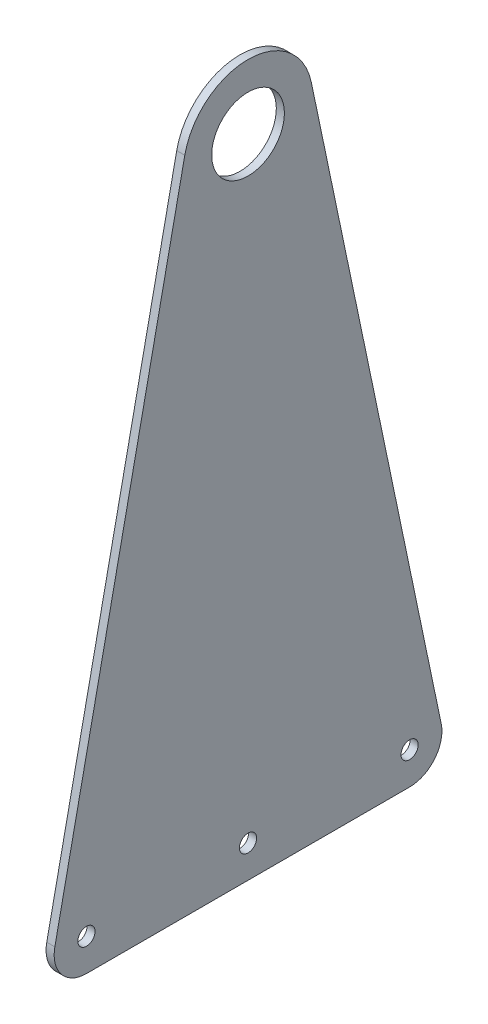
ISO-10303-21;
HEADER;
FILE_DESCRIPTION(('STEP AP214'),'2;1');
FILE_NAME('part.step','',(''),(''),'','','');
FILE_SCHEMA(('AUTOMOTIVE_DESIGN { 1 0 10303 214 1 1 1 1 }'));
ENDSEC;
DATA;
#1=APPLICATION_CONTEXT('core data for automotive mechanical design processes');
#2=APPLICATION_PROTOCOL_DEFINITION('international standard','automotive_design',2000,#1);
#3=PRODUCT_CONTEXT('',#1,'mechanical');
#4=PRODUCT('Part','Part','',(#3));
#5=PRODUCT_RELATED_PRODUCT_CATEGORY('part','',(#4));
#6=PRODUCT_DEFINITION_FORMATION('','',#4);
#7=PRODUCT_DEFINITION_CONTEXT('part definition',#1,'design');
#8=PRODUCT_DEFINITION('design','',#6,#7);
#9=PRODUCT_DEFINITION_SHAPE('','',#8);
#10=(LENGTH_UNIT() NAMED_UNIT(*) SI_UNIT(.MILLI.,.METRE.));
#11=(NAMED_UNIT(*) PLANE_ANGLE_UNIT() SI_UNIT($,.RADIAN.));
#12=(NAMED_UNIT(*) SI_UNIT($,.STERADIAN.) SOLID_ANGLE_UNIT());
#13=UNCERTAINTY_MEASURE_WITH_UNIT(LENGTH_MEASURE(1.E-05),#10,'distance_accuracy_value','');
#14=(GEOMETRIC_REPRESENTATION_CONTEXT(3) GLOBAL_UNCERTAINTY_ASSIGNED_CONTEXT((#13)) GLOBAL_UNIT_ASSIGNED_CONTEXT((#10,
#11,#12)) REPRESENTATION_CONTEXT('',''));
#15=CARTESIAN_POINT('',(0.,0.,0.));
#16=DIRECTION('',(0.,0.,1.));
#17=DIRECTION('',(1.,0.,0.));
#18=AXIS2_PLACEMENT_3D('',#15,#16,#17);
#19=CARTESIAN_POINT('',(3.175,-241.3,63.5));
#20=DIRECTION('',(1.,0.,0.));
#21=DIRECTION('',(0.,0.,-1.));
#22=AXIS2_PLACEMENT_3D('',#19,#20,#21);
#23=PLANE('',#22);
#24=CARTESIAN_POINT('',(3.175,-241.3,0.));
#25=DIRECTION('',(1.,0.,0.));
#26=DIRECTION('',(0.,0.,-1.));
#27=AXIS2_PLACEMENT_3D('',#24,#25,#26);
#28=CIRCLE('',#27,3.3782);
#29=CARTESIAN_POINT('',(3.175,-241.3,-3.3782));
#30=VERTEX_POINT('',#29);
#31=EDGE_CURVE('E216',#30,#30,#28,.T.);
#32=ORIENTED_EDGE('',*,*,#31,.F.);
#33=EDGE_LOOP('',(#32));
#34=FACE_BOUND('',#33,.T.);
#35=CARTESIAN_POINT('',(3.175,0.,0.));
#36=DIRECTION('',(1.,0.,0.));
#37=DIRECTION('',(0.,0.,-1.));
#38=AXIS2_PLACEMENT_3D('',#35,#36,#37);
#39=CIRCLE('',#38,14.2875);
#40=CARTESIAN_POINT('',(3.175,0.,-14.2875));
#41=VERTEX_POINT('',#40);
#42=EDGE_CURVE('E138',#41,#41,#39,.T.);
#43=ORIENTED_EDGE('',*,*,#42,.F.);
#44=EDGE_LOOP('',(#43));
#45=FACE_BOUND('',#44,.T.);
#46=CARTESIAN_POINT('',(3.175,-241.3,63.5));
#47=DIRECTION('',(1.,0.,0.));
#48=DIRECTION('',(0.,0.,-1.));
#49=AXIS2_PLACEMENT_3D('',#46,#47,#48);
#50=CIRCLE('',#49,12.7);
#51=CARTESIAN_POINT('',(3.175,-238.697253960448,75.9304349502982));
#52=VERTEX_POINT('',#51);
#53=CARTESIAN_POINT('',(3.175,-254.,63.5));
#54=VERTEX_POINT('',#53);
#55=EDGE_CURVE('E150',#52,#54,#50,.T.);
#56=ORIENTED_EDGE('',*,*,#55,.T.);
#57=DIRECTION('',(0.,0.,-1.));
#58=VECTOR('',#57,1.);
#59=CARTESIAN_POINT('',(3.175,-254.,-63.5));
#60=LINE('',#59,#58);
#61=CARTESIAN_POINT('',(3.175,-254.,-63.5));
#62=VERTEX_POINT('',#61);
#63=EDGE_CURVE('E98',#54,#62,#60,.T.);
#64=ORIENTED_EDGE('',*,*,#63,.T.);
#65=CARTESIAN_POINT('',(3.175,-241.3,-63.5));
#66=DIRECTION('',(1.,0.,0.));
#67=DIRECTION('',(0.,0.,-1.));
#68=AXIS2_PLACEMENT_3D('',#65,#66,#67);
#69=CIRCLE('',#68,12.7);
#70=CARTESIAN_POINT('',(3.175,-238.697253960448,-75.9304349502982));
#71=VERTEX_POINT('',#70);
#72=EDGE_CURVE('E111',#62,#71,#69,.T.);
#73=ORIENTED_EDGE('',*,*,#72,.T.);
#74=DIRECTION('',(0.,0.978774405535293,0.204940633035603));
#75=VECTOR('',#74,1.);
#76=CARTESIAN_POINT('',(3.175,5.20549207910432,-24.8608699005964));
#77=LINE('',#76,#75);
#78=CARTESIAN_POINT('',(3.175,5.20549207910432,-24.8608699005964));
#79=VERTEX_POINT('',#78);
#80=EDGE_CURVE('E105',#71,#79,#77,.T.);
#81=ORIENTED_EDGE('',*,*,#80,.T.);
#82=CARTESIAN_POINT('',(3.175,0.,0.));
#83=DIRECTION('',(1.,0.,0.));
#84=DIRECTION('',(0.,0.,-1.));
#85=AXIS2_PLACEMENT_3D('',#82,#83,#84);
#86=CIRCLE('',#85,25.4);
#87=CARTESIAN_POINT('',(3.175,5.20549207910433,24.8608699005964));
#88=VERTEX_POINT('',#87);
#89=EDGE_CURVE('E109',#79,#88,#86,.T.);
#90=ORIENTED_EDGE('',*,*,#89,.T.);
#91=DIRECTION('',(0.,-0.978774405535293,0.204940633035603));
#92=VECTOR('',#91,1.);
#93=CARTESIAN_POINT('',(3.175,-238.697253960448,75.9304349502982));
#94=LINE('',#93,#92);
#95=EDGE_CURVE('E61',#88,#52,#94,.T.);
#96=ORIENTED_EDGE('',*,*,#95,.T.);
#97=EDGE_LOOP('',(#56,#64,#73,#81,#90,#96));
#98=FACE_BOUND('',#97,.T.);
#99=CARTESIAN_POINT('',(3.175,-241.3,63.5));
#100=DIRECTION('',(1.,0.,0.));
#101=DIRECTION('',(0.,0.,-1.));
#102=AXIS2_PLACEMENT_3D('',#99,#100,#101);
#103=CIRCLE('',#102,3.3782);
#104=CARTESIAN_POINT('',(3.175,-241.3,60.1218));
#105=VERTEX_POINT('',#104);
#106=EDGE_CURVE('E224',#105,#105,#103,.T.);
#107=ORIENTED_EDGE('',*,*,#106,.F.);
#108=EDGE_LOOP('',(#107));
#109=FACE_BOUND('',#108,.T.);
#110=CARTESIAN_POINT('',(3.175,-241.3,-63.5));
#111=DIRECTION('',(1.,0.,0.));
#112=DIRECTION('',(0.,0.,-1.));
#113=AXIS2_PLACEMENT_3D('',#110,#111,#112);
#114=CIRCLE('',#113,3.37819999999999);
#115=CARTESIAN_POINT('',(3.175,-241.3,-66.8782));
#116=VERTEX_POINT('',#115);
#117=EDGE_CURVE('E205',#116,#116,#114,.T.);
#118=ORIENTED_EDGE('',*,*,#117,.F.);
#119=EDGE_LOOP('',(#118));
#120=FACE_BOUND('',#119,.T.);
#121=ADVANCED_FACE('F43',(#34,#45,#98,#109,#120),#23,.T.);
#122=CARTESIAN_POINT('',(0.,-241.3,63.5));
#123=DIRECTION('',(1.,0.,0.));
#124=DIRECTION('',(0.,0.,-1.));
#125=AXIS2_PLACEMENT_3D('',#122,#123,#124);
#126=PLANE('',#125);
#127=CARTESIAN_POINT('',(0.,-241.3,63.5));
#128=DIRECTION('',(1.,0.,0.));
#129=DIRECTION('',(0.,0.,-1.));
#130=AXIS2_PLACEMENT_3D('',#127,#128,#129);
#131=CIRCLE('',#130,12.7);
#132=CARTESIAN_POINT('',(0.,-238.697253960448,75.9304349502982));
#133=VERTEX_POINT('',#132);
#134=CARTESIAN_POINT('',(0.,-254.,63.5));
#135=VERTEX_POINT('',#134);
#136=EDGE_CURVE('E133',#133,#135,#131,.T.);
#137=ORIENTED_EDGE('',*,*,#136,.F.);
#138=DIRECTION('',(0.,-0.978774405535293,0.204940633035603));
#139=VECTOR('',#138,1.);
#140=CARTESIAN_POINT('',(0.,-238.697253960448,75.9304349502982));
#141=LINE('',#140,#139);
#142=CARTESIAN_POINT('',(0.,5.20549207910433,24.8608699005964));
#143=VERTEX_POINT('',#142);
#144=EDGE_CURVE('E90',#143,#133,#141,.T.);
#145=ORIENTED_EDGE('',*,*,#144,.F.);
#146=CARTESIAN_POINT('',(0.,0.,0.));
#147=DIRECTION('',(1.,0.,0.));
#148=DIRECTION('',(0.,0.,-1.));
#149=AXIS2_PLACEMENT_3D('',#146,#147,#148);
#150=CIRCLE('',#149,25.4);
#151=CARTESIAN_POINT('',(0.,5.20549207910432,-24.8608699005964));
#152=VERTEX_POINT('',#151);
#153=EDGE_CURVE('E84',#152,#143,#150,.T.);
#154=ORIENTED_EDGE('',*,*,#153,.F.);
#155=DIRECTION('',(0.,0.978774405535293,0.204940633035603));
#156=VECTOR('',#155,1.);
#157=CARTESIAN_POINT('',(0.,5.20549207910432,-24.8608699005964));
#158=LINE('',#157,#156);
#159=CARTESIAN_POINT('',(0.,-238.697253960448,-75.9304349502982));
#160=VERTEX_POINT('',#159);
#161=EDGE_CURVE('E120',#160,#152,#158,.T.);
#162=ORIENTED_EDGE('',*,*,#161,.F.);
#163=CARTESIAN_POINT('',(0.,-241.3,-63.5));
#164=DIRECTION('',(1.,0.,0.));
#165=DIRECTION('',(0.,0.,-1.));
#166=AXIS2_PLACEMENT_3D('',#163,#164,#165);
#167=CIRCLE('',#166,12.7);
#168=CARTESIAN_POINT('',(0.,-254.,-63.5));
#169=VERTEX_POINT('',#168);
#170=EDGE_CURVE('E141',#169,#160,#167,.T.);
#171=ORIENTED_EDGE('',*,*,#170,.F.);
#172=DIRECTION('',(0.,0.,-1.));
#173=VECTOR('',#172,1.);
#174=CARTESIAN_POINT('',(0.,-254.,-63.5));
#175=LINE('',#174,#173);
#176=EDGE_CURVE('E137',#135,#169,#175,.T.);
#177=ORIENTED_EDGE('',*,*,#176,.F.);
#178=EDGE_LOOP('',(#137,#145,#154,#162,#171,#177));
#179=FACE_BOUND('',#178,.T.);
#180=CARTESIAN_POINT('',(0.,0.,0.));
#181=DIRECTION('',(1.,0.,0.));
#182=DIRECTION('',(0.,0.,-1.));
#183=AXIS2_PLACEMENT_3D('',#180,#181,#182);
#184=CIRCLE('',#183,14.2875);
#185=CARTESIAN_POINT('',(0.,0.,-14.2875));
#186=VERTEX_POINT('',#185);
#187=EDGE_CURVE('E228',#186,#186,#184,.T.);
#188=ORIENTED_EDGE('',*,*,#187,.T.);
#189=EDGE_LOOP('',(#188));
#190=FACE_BOUND('',#189,.T.);
#191=CARTESIAN_POINT('',(0.,-241.3,63.5));
#192=DIRECTION('',(1.,0.,0.));
#193=DIRECTION('',(0.,0.,-1.));
#194=AXIS2_PLACEMENT_3D('',#191,#192,#193);
#195=CIRCLE('',#194,3.3782);
#196=CARTESIAN_POINT('',(0.,-241.3,60.1218));
#197=VERTEX_POINT('',#196);
#198=EDGE_CURVE('E220',#197,#197,#195,.T.);
#199=ORIENTED_EDGE('',*,*,#198,.T.);
#200=EDGE_LOOP('',(#199));
#201=FACE_BOUND('',#200,.T.);
#202=CARTESIAN_POINT('',(0.,-241.3,0.));
#203=DIRECTION('',(1.,0.,0.));
#204=DIRECTION('',(0.,0.,-1.));
#205=AXIS2_PLACEMENT_3D('',#202,#203,#204);
#206=CIRCLE('',#205,3.3782);
#207=CARTESIAN_POINT('',(0.,-241.3,-3.3782));
#208=VERTEX_POINT('',#207);
#209=EDGE_CURVE('E213',#208,#208,#206,.T.);
#210=ORIENTED_EDGE('',*,*,#209,.T.);
#211=EDGE_LOOP('',(#210));
#212=FACE_BOUND('',#211,.T.);
#213=CARTESIAN_POINT('',(0.,-241.3,-63.5));
#214=DIRECTION('',(1.,0.,0.));
#215=DIRECTION('',(0.,0.,-1.));
#216=AXIS2_PLACEMENT_3D('',#213,#214,#215);
#217=CIRCLE('',#216,3.37819999999999);
#218=CARTESIAN_POINT('',(0.,-241.3,-66.8782));
#219=VERTEX_POINT('',#218);
#220=EDGE_CURVE('E208',#219,#219,#217,.T.);
#221=ORIENTED_EDGE('',*,*,#220,.T.);
#222=EDGE_LOOP('',(#221));
#223=FACE_BOUND('',#222,.T.);
#224=ADVANCED_FACE('F163',(#179,#190,#201,#212,#223),#126,.F.);
#225=CARTESIAN_POINT('',(3.175,-241.3,63.5));
#226=DIRECTION('',(-1.,0.,0.));
#227=DIRECTION('',(0.,0.,1.));
#228=AXIS2_PLACEMENT_3D('',#225,#226,#227);
#229=CYLINDRICAL_SURFACE('',#228,12.7);
#230=ORIENTED_EDGE('',*,*,#136,.T.);
#231=DIRECTION('',(-1.,0.,0.));
#232=VECTOR('',#231,1.);
#233=CARTESIAN_POINT('',(3.175,-254.,63.5));
#234=LINE('',#233,#232);
#235=EDGE_CURVE('E11',#54,#135,#234,.T.);
#236=ORIENTED_EDGE('',*,*,#235,.F.);
#237=ORIENTED_EDGE('',*,*,#55,.F.);
#238=DIRECTION('',(-1.,0.,0.));
#239=VECTOR('',#238,1.);
#240=CARTESIAN_POINT('',(3.175,-238.697253960448,75.9304349502982));
#241=LINE('',#240,#239);
#242=EDGE_CURVE('E129',#52,#133,#241,.T.);
#243=ORIENTED_EDGE('',*,*,#242,.T.);
#244=EDGE_LOOP('',(#230,#236,#237,#243));
#245=FACE_BOUND('',#244,.T.);
#246=ADVANCED_FACE('F45',(#245),#229,.T.);
#247=CARTESIAN_POINT('',(3.175,-254.,-63.5));
#248=DIRECTION('',(0.,1.,0.));
#249=DIRECTION('',(0.,0.,1.));
#250=AXIS2_PLACEMENT_3D('',#247,#248,#249);
#251=PLANE('',#250);
#252=ORIENTED_EDGE('',*,*,#176,.T.);
#253=DIRECTION('',(-1.,0.,0.));
#254=VECTOR('',#253,1.);
#255=CARTESIAN_POINT('',(3.175,-254.,-63.5));
#256=LINE('',#255,#254);
#257=EDGE_CURVE('E53',#62,#169,#256,.T.);
#258=ORIENTED_EDGE('',*,*,#257,.F.);
#259=ORIENTED_EDGE('',*,*,#63,.F.);
#260=ORIENTED_EDGE('',*,*,#235,.T.);
#261=EDGE_LOOP('',(#252,#258,#259,#260));
#262=FACE_BOUND('',#261,.T.);
#263=ADVANCED_FACE('F296',(#262),#251,.F.);
#264=CARTESIAN_POINT('',(3.175,-241.3,-63.5));
#265=DIRECTION('',(-1.,0.,0.));
#266=DIRECTION('',(0.,0.,1.));
#267=AXIS2_PLACEMENT_3D('',#264,#265,#266);
#268=CYLINDRICAL_SURFACE('',#267,12.7);
#269=ORIENTED_EDGE('',*,*,#170,.T.);
#270=DIRECTION('',(-1.,0.,0.));
#271=VECTOR('',#270,1.);
#272=CARTESIAN_POINT('',(3.175,-238.697253960448,-75.9304349502982));
#273=LINE('',#272,#271);
#274=EDGE_CURVE('E122',#71,#160,#273,.T.);
#275=ORIENTED_EDGE('',*,*,#274,.F.);
#276=ORIENTED_EDGE('',*,*,#72,.F.);
#277=ORIENTED_EDGE('',*,*,#257,.T.);
#278=EDGE_LOOP('',(#269,#275,#276,#277));
#279=FACE_BOUND('',#278,.T.);
#280=ADVANCED_FACE('F160',(#279),#268,.T.);
#281=CARTESIAN_POINT('',(3.175,5.20549207910432,-24.8608699005964));
#282=DIRECTION('',(0.,-0.204940633035603,0.978774405535293));
#283=DIRECTION('',(0.,-0.978774405535293,-0.204940633035603));
#284=AXIS2_PLACEMENT_3D('',#281,#282,#283);
#285=PLANE('',#284);
#286=ORIENTED_EDGE('',*,*,#161,.T.);
#287=DIRECTION('',(-1.,0.,0.));
#288=VECTOR('',#287,1.);
#289=CARTESIAN_POINT('',(3.175,5.20549207910432,-24.8608699005964));
#290=LINE('',#289,#288);
#291=EDGE_CURVE('E117',#79,#152,#290,.T.);
#292=ORIENTED_EDGE('',*,*,#291,.F.);
#293=ORIENTED_EDGE('',*,*,#80,.F.);
#294=ORIENTED_EDGE('',*,*,#274,.T.);
#295=EDGE_LOOP('',(#286,#292,#293,#294));
#296=FACE_BOUND('',#295,.T.);
#297=ADVANCED_FACE('F118',(#296),#285,.F.);
#298=CARTESIAN_POINT('',(3.175,0.,0.));
#299=DIRECTION('',(-1.,0.,0.));
#300=DIRECTION('',(0.,0.,1.));
#301=AXIS2_PLACEMENT_3D('',#298,#299,#300);
#302=CYLINDRICAL_SURFACE('',#301,25.4);
#303=ORIENTED_EDGE('',*,*,#153,.T.);
#304=DIRECTION('',(-1.,0.,0.));
#305=VECTOR('',#304,1.);
#306=CARTESIAN_POINT('',(3.175,5.20549207910433,24.8608699005964));
#307=LINE('',#306,#305);
#308=EDGE_CURVE('E123',#88,#143,#307,.T.);
#309=ORIENTED_EDGE('',*,*,#308,.F.);
#310=ORIENTED_EDGE('',*,*,#89,.F.);
#311=ORIENTED_EDGE('',*,*,#291,.T.);
#312=EDGE_LOOP('',(#303,#309,#310,#311));
#313=FACE_BOUND('',#312,.T.);
#314=ADVANCED_FACE('F125',(#313),#302,.T.);
#315=CARTESIAN_POINT('',(3.175,-238.697253960448,75.9304349502982));
#316=DIRECTION('',(0.,-0.204940633035603,-0.978774405535293));
#317=DIRECTION('',(0.,0.978774405535293,-0.204940633035603));
#318=AXIS2_PLACEMENT_3D('',#315,#316,#317);
#319=PLANE('',#318);
#320=ORIENTED_EDGE('',*,*,#144,.T.);
#321=ORIENTED_EDGE('',*,*,#242,.F.);
#322=ORIENTED_EDGE('',*,*,#95,.F.);
#323=ORIENTED_EDGE('',*,*,#308,.T.);
#324=EDGE_LOOP('',(#320,#321,#322,#323));
#325=FACE_BOUND('',#324,.T.);
#326=ADVANCED_FACE('F168',(#325),#319,.F.);
#327=CARTESIAN_POINT('',(3.175,0.,0.));
#328=DIRECTION('',(-1.,0.,0.));
#329=DIRECTION('',(0.,0.,1.));
#330=AXIS2_PLACEMENT_3D('',#327,#328,#329);
#331=CYLINDRICAL_SURFACE('',#330,14.2875);
#332=ORIENTED_EDGE('',*,*,#42,.T.);
#333=EDGE_LOOP('',(#332));
#334=FACE_BOUND('',#333,.T.);
#335=ORIENTED_EDGE('',*,*,#187,.F.);
#336=EDGE_LOOP('',(#335));
#337=FACE_BOUND('',#336,.T.);
#338=ADVANCED_FACE('F170',(#334,#337),#331,.F.);
#339=CARTESIAN_POINT('',(3.175,-241.3,63.5));
#340=DIRECTION('',(-1.,0.,0.));
#341=DIRECTION('',(0.,0.,1.));
#342=AXIS2_PLACEMENT_3D('',#339,#340,#341);
#343=CYLINDRICAL_SURFACE('',#342,3.3782);
#344=ORIENTED_EDGE('',*,*,#106,.T.);
#345=EDGE_LOOP('',(#344));
#346=FACE_BOUND('',#345,.T.);
#347=ORIENTED_EDGE('',*,*,#198,.F.);
#348=EDGE_LOOP('',(#347));
#349=FACE_BOUND('',#348,.T.);
#350=ADVANCED_FACE('F176',(#346,#349),#343,.F.);
#351=CARTESIAN_POINT('',(3.175,-241.3,0.));
#352=DIRECTION('',(-1.,0.,0.));
#353=DIRECTION('',(0.,0.,1.));
#354=AXIS2_PLACEMENT_3D('',#351,#352,#353);
#355=CYLINDRICAL_SURFACE('',#354,3.3782);
#356=ORIENTED_EDGE('',*,*,#31,.T.);
#357=EDGE_LOOP('',(#356));
#358=FACE_BOUND('',#357,.T.);
#359=ORIENTED_EDGE('',*,*,#209,.F.);
#360=EDGE_LOOP('',(#359));
#361=FACE_BOUND('',#360,.T.);
#362=ADVANCED_FACE('F192',(#358,#361),#355,.F.);
#363=CARTESIAN_POINT('',(3.175,-241.3,-63.5));
#364=DIRECTION('',(-1.,0.,0.));
#365=DIRECTION('',(0.,0.,1.));
#366=AXIS2_PLACEMENT_3D('',#363,#364,#365);
#367=CYLINDRICAL_SURFACE('',#366,3.37819999999999);
#368=ORIENTED_EDGE('',*,*,#117,.T.);
#369=EDGE_LOOP('',(#368));
#370=FACE_BOUND('',#369,.T.);
#371=ORIENTED_EDGE('',*,*,#220,.F.);
#372=EDGE_LOOP('',(#371));
#373=FACE_BOUND('',#372,.T.);
#374=ADVANCED_FACE('F196',(#370,#373),#367,.F.);
#375=CLOSED_SHELL('',(#121,#224,#246,#263,#280,#297,#314,#326,#338,#350,#362,#374));
#376=MANIFOLD_SOLID_BREP('B2',#375);
#377=ADVANCED_BREP_SHAPE_REPRESENTATION('',(#18,#376),#14);
#378=SHAPE_DEFINITION_REPRESENTATION(#9,#377);
ENDSEC;
END-ISO-10303-21;
